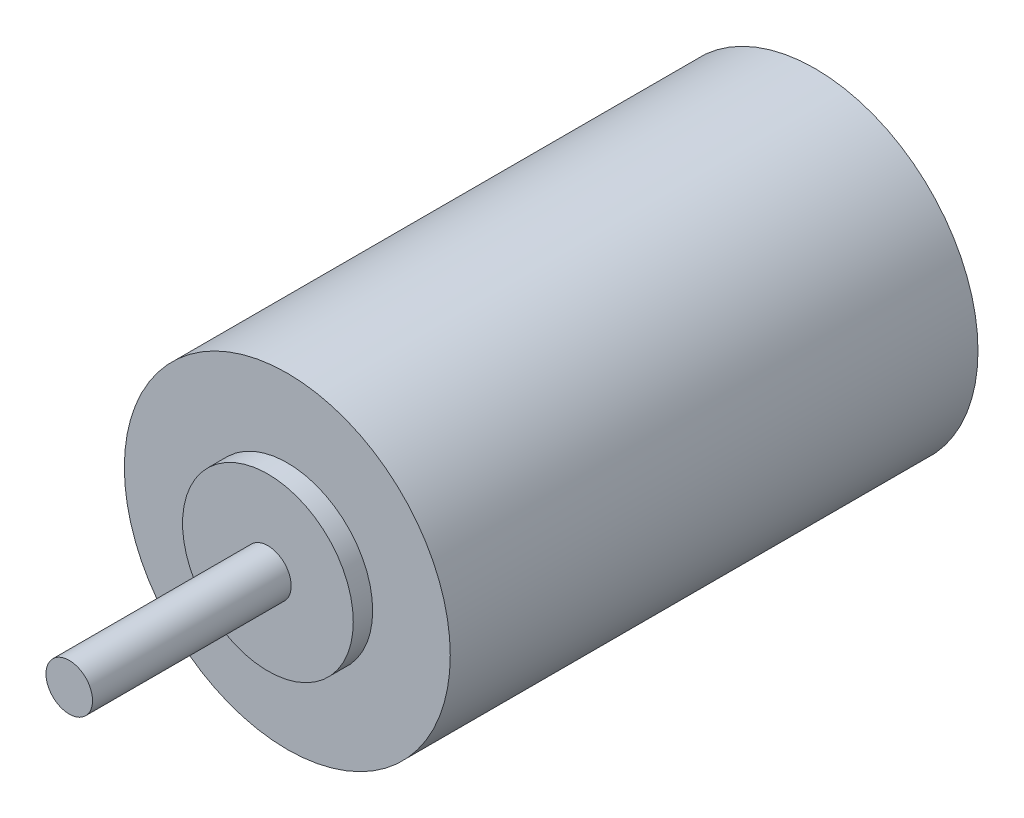
ISO-10303-21;
HEADER;
FILE_DESCRIPTION(('STEP AP214'),'2;1');
FILE_NAME('part.step','',(''),(''),'','','');
FILE_SCHEMA(('AUTOMOTIVE_DESIGN { 1 0 10303 214 1 1 1 1 }'));
ENDSEC;
DATA;
#1=APPLICATION_CONTEXT('core data for automotive mechanical design processes');
#2=APPLICATION_PROTOCOL_DEFINITION('international standard','automotive_design',2000,#1);
#3=PRODUCT_CONTEXT('',#1,'mechanical');
#4=PRODUCT('Part','Part','',(#3));
#5=PRODUCT_RELATED_PRODUCT_CATEGORY('part','',(#4));
#6=PRODUCT_DEFINITION_FORMATION('','',#4);
#7=PRODUCT_DEFINITION_CONTEXT('part definition',#1,'design');
#8=PRODUCT_DEFINITION('design','',#6,#7);
#9=PRODUCT_DEFINITION_SHAPE('','',#8);
#10=(LENGTH_UNIT() NAMED_UNIT(*) SI_UNIT(.MILLI.,.METRE.));
#11=(NAMED_UNIT(*) PLANE_ANGLE_UNIT() SI_UNIT($,.RADIAN.));
#12=(NAMED_UNIT(*) SI_UNIT($,.STERADIAN.) SOLID_ANGLE_UNIT());
#13=UNCERTAINTY_MEASURE_WITH_UNIT(LENGTH_MEASURE(1.E-05),#10,'distance_accuracy_value','');
#14=(GEOMETRIC_REPRESENTATION_CONTEXT(3) GLOBAL_UNCERTAINTY_ASSIGNED_CONTEXT((#13)) GLOBAL_UNIT_ASSIGNED_CONTEXT((#10,
#11,#12)) REPRESENTATION_CONTEXT('',''));
#15=CARTESIAN_POINT('',(0.,0.,0.));
#16=DIRECTION('',(0.,0.,1.));
#17=DIRECTION('',(1.,0.,0.));
#18=AXIS2_PLACEMENT_3D('',#15,#16,#17);
#19=CARTESIAN_POINT('',(0.,0.,68.));
#20=DIRECTION('',(0.,0.,-1.));
#21=DIRECTION('',(-1.,0.,0.));
#22=AXIS2_PLACEMENT_3D('',#19,#20,#21);
#23=CYLINDRICAL_SURFACE('',#22,21.);
#24=CARTESIAN_POINT('',(0.,0.,68.));
#25=DIRECTION('',(0.,0.,1.));
#26=DIRECTION('',(1.,0.,0.));
#27=AXIS2_PLACEMENT_3D('',#24,#25,#26);
#28=CIRCLE('',#27,21.);
#29=CARTESIAN_POINT('',(21.,0.,68.));
#30=VERTEX_POINT('',#29);
#31=EDGE_CURVE('E51',#30,#30,#28,.T.);
#32=ORIENTED_EDGE('',*,*,#31,.F.);
#33=EDGE_LOOP('',(#32));
#34=FACE_BOUND('',#33,.T.);
#35=CARTESIAN_POINT('',(0.,0.,0.));
#36=DIRECTION('',(0.,0.,1.));
#37=DIRECTION('',(1.,0.,0.));
#38=AXIS2_PLACEMENT_3D('',#35,#36,#37);
#39=CIRCLE('',#38,21.);
#40=CARTESIAN_POINT('',(21.,0.,0.));
#41=VERTEX_POINT('',#40);
#42=EDGE_CURVE('E40',#41,#41,#39,.T.);
#43=ORIENTED_EDGE('',*,*,#42,.T.);
#44=EDGE_LOOP('',(#43));
#45=FACE_BOUND('',#44,.T.);
#46=ADVANCED_FACE('F37',(#34,#45),#23,.T.);
#47=CARTESIAN_POINT('',(0.,0.,68.));
#48=DIRECTION('',(0.,0.,1.));
#49=DIRECTION('',(1.,0.,0.));
#50=AXIS2_PLACEMENT_3D('',#47,#48,#49);
#51=PLANE('',#50);
#52=CARTESIAN_POINT('',(0.,0.,68.));
#53=DIRECTION('',(0.,0.,1.));
#54=DIRECTION('',(1.,0.,0.));
#55=AXIS2_PLACEMENT_3D('',#52,#53,#54);
#56=CIRCLE('',#55,11.);
#57=CARTESIAN_POINT('',(11.,0.,68.));
#58=VERTEX_POINT('',#57);
#59=EDGE_CURVE('E45',#58,#58,#56,.T.);
#60=ORIENTED_EDGE('',*,*,#59,.F.);
#61=EDGE_LOOP('',(#60));
#62=FACE_BOUND('',#61,.T.);
#63=ORIENTED_EDGE('',*,*,#31,.T.);
#64=EDGE_LOOP('',(#63));
#65=FACE_BOUND('',#64,.T.);
#66=ADVANCED_FACE('F71',(#62,#65),#51,.T.);
#67=CARTESIAN_POINT('',(0.,0.,0.));
#68=DIRECTION('',(0.,0.,1.));
#69=DIRECTION('',(1.,0.,0.));
#70=AXIS2_PLACEMENT_3D('',#67,#68,#69);
#71=PLANE('',#70);
#72=ORIENTED_EDGE('',*,*,#42,.F.);
#73=EDGE_LOOP('',(#72));
#74=FACE_BOUND('',#73,.T.);
#75=ADVANCED_FACE('F68',(#74),#71,.F.);
#76=CARTESIAN_POINT('',(0.,0.,70.5));
#77=DIRECTION('',(0.,0.,-1.));
#78=DIRECTION('',(-1.,0.,0.));
#79=AXIS2_PLACEMENT_3D('',#76,#77,#78);
#80=CYLINDRICAL_SURFACE('',#79,11.);
#81=CARTESIAN_POINT('',(0.,0.,70.5));
#82=DIRECTION('',(0.,0.,1.));
#83=DIRECTION('',(1.,0.,0.));
#84=AXIS2_PLACEMENT_3D('',#81,#82,#83);
#85=CIRCLE('',#84,11.);
#86=CARTESIAN_POINT('',(11.,0.,70.5));
#87=VERTEX_POINT('',#86);
#88=EDGE_CURVE('E56',#87,#87,#85,.T.);
#89=ORIENTED_EDGE('',*,*,#88,.F.);
#90=EDGE_LOOP('',(#89));
#91=FACE_BOUND('',#90,.T.);
#92=ORIENTED_EDGE('',*,*,#59,.T.);
#93=EDGE_LOOP('',(#92));
#94=FACE_BOUND('',#93,.T.);
#95=ADVANCED_FACE('F70',(#91,#94),#80,.T.);
#96=CARTESIAN_POINT('',(0.,0.,70.5));
#97=DIRECTION('',(0.,0.,1.));
#98=DIRECTION('',(1.,0.,0.));
#99=AXIS2_PLACEMENT_3D('',#96,#97,#98);
#100=PLANE('',#99);
#101=CARTESIAN_POINT('',(0.,0.,70.5));
#102=DIRECTION('',(0.,0.,1.));
#103=DIRECTION('',(1.,0.,0.));
#104=AXIS2_PLACEMENT_3D('',#101,#102,#103);
#105=CIRCLE('',#104,3.);
#106=CARTESIAN_POINT('',(3.,0.,70.5));
#107=VERTEX_POINT('',#106);
#108=EDGE_CURVE('E10',#107,#107,#105,.T.);
#109=ORIENTED_EDGE('',*,*,#108,.F.);
#110=EDGE_LOOP('',(#109));
#111=FACE_BOUND('',#110,.T.);
#112=ORIENTED_EDGE('',*,*,#88,.T.);
#113=EDGE_LOOP('',(#112));
#114=FACE_BOUND('',#113,.T.);
#115=ADVANCED_FACE('F76',(#111,#114),#100,.T.);
#116=CARTESIAN_POINT('',(0.,0.,96.1));
#117=DIRECTION('',(0.,0.,-1.));
#118=DIRECTION('',(-1.,0.,0.));
#119=AXIS2_PLACEMENT_3D('',#116,#117,#118);
#120=CYLINDRICAL_SURFACE('',#119,3.);
#121=CARTESIAN_POINT('',(0.,0.,96.1));
#122=DIRECTION('',(0.,0.,1.));
#123=DIRECTION('',(1.,0.,0.));
#124=AXIS2_PLACEMENT_3D('',#121,#122,#123);
#125=CIRCLE('',#124,3.);
#126=CARTESIAN_POINT('',(3.,0.,96.1));
#127=VERTEX_POINT('',#126);
#128=EDGE_CURVE('E55',#127,#127,#125,.T.);
#129=ORIENTED_EDGE('',*,*,#128,.F.);
#130=EDGE_LOOP('',(#129));
#131=FACE_BOUND('',#130,.T.);
#132=ORIENTED_EDGE('',*,*,#108,.T.);
#133=EDGE_LOOP('',(#132));
#134=FACE_BOUND('',#133,.T.);
#135=ADVANCED_FACE('F106',(#131,#134),#120,.T.);
#136=CARTESIAN_POINT('',(0.,0.,96.1));
#137=DIRECTION('',(0.,0.,1.));
#138=DIRECTION('',(1.,0.,0.));
#139=AXIS2_PLACEMENT_3D('',#136,#137,#138);
#140=PLANE('',#139);
#141=ORIENTED_EDGE('',*,*,#128,.T.);
#142=EDGE_LOOP('',(#141));
#143=FACE_BOUND('',#142,.T.);
#144=ADVANCED_FACE('F116',(#143),#140,.T.);
#145=CLOSED_SHELL('',(#46,#66,#75,#95,#115,#135,#144));
#146=MANIFOLD_SOLID_BREP('B2',#145);
#147=ADVANCED_BREP_SHAPE_REPRESENTATION('',(#18,#146),#14);
#148=SHAPE_DEFINITION_REPRESENTATION(#9,#147);
ENDSEC;
END-ISO-10303-21;
